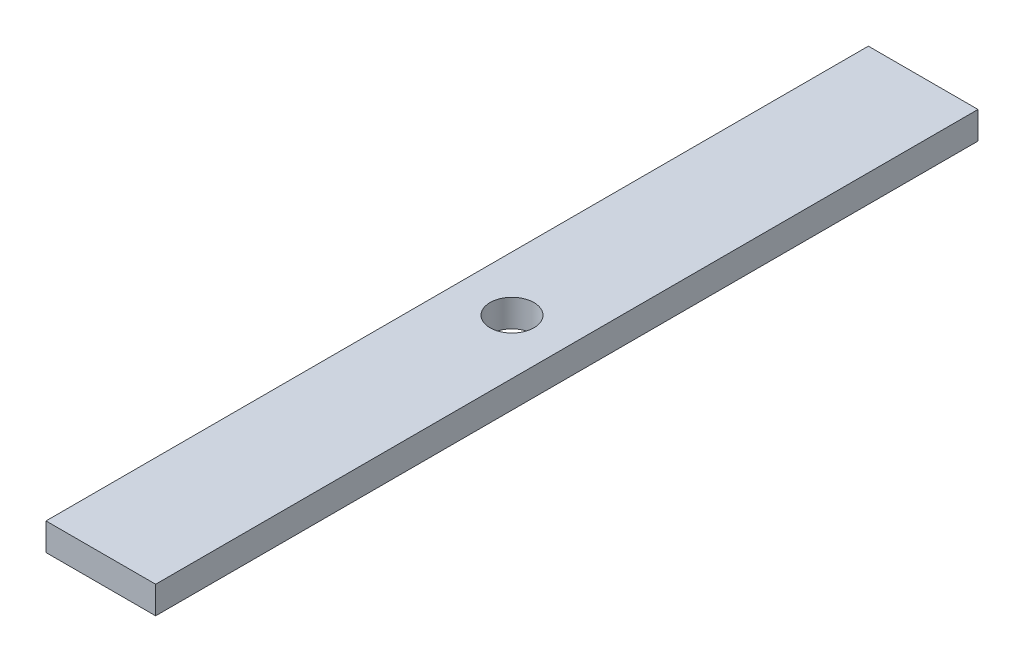
ISO-10303-21;
HEADER;
FILE_DESCRIPTION(('STEP AP214'),'2;1');
FILE_NAME('part.step','',(''),(''),'','','');
FILE_SCHEMA(('AUTOMOTIVE_DESIGN { 1 0 10303 214 1 1 1 1 }'));
ENDSEC;
DATA;
#1=APPLICATION_CONTEXT('core data for automotive mechanical design processes');
#2=APPLICATION_PROTOCOL_DEFINITION('international standard','automotive_design',2000,#1);
#3=PRODUCT_CONTEXT('',#1,'mechanical');
#4=PRODUCT('Part','Part','',(#3));
#5=PRODUCT_RELATED_PRODUCT_CATEGORY('part','',(#4));
#6=PRODUCT_DEFINITION_FORMATION('','',#4);
#7=PRODUCT_DEFINITION_CONTEXT('part definition',#1,'design');
#8=PRODUCT_DEFINITION('design','',#6,#7);
#9=PRODUCT_DEFINITION_SHAPE('','',#8);
#10=(LENGTH_UNIT() NAMED_UNIT(*) SI_UNIT(.MILLI.,.METRE.));
#11=(NAMED_UNIT(*) PLANE_ANGLE_UNIT() SI_UNIT($,.RADIAN.));
#12=(NAMED_UNIT(*) SI_UNIT($,.STERADIAN.) SOLID_ANGLE_UNIT());
#13=UNCERTAINTY_MEASURE_WITH_UNIT(LENGTH_MEASURE(1.E-05),#10,'distance_accuracy_value','');
#14=(GEOMETRIC_REPRESENTATION_CONTEXT(3) GLOBAL_UNCERTAINTY_ASSIGNED_CONTEXT((#13)) GLOBAL_UNIT_ASSIGNED_CONTEXT((#10,
#11,#12)) REPRESENTATION_CONTEXT('',''));
#15=CARTESIAN_POINT('',(0.,0.,0.));
#16=DIRECTION('',(0.,0.,1.));
#17=DIRECTION('',(1.,0.,0.));
#18=AXIS2_PLACEMENT_3D('',#15,#16,#17);
#19=CARTESIAN_POINT('',(-10.,2.5,106.));
#20=DIRECTION('',(1.,0.,0.));
#21=DIRECTION('',(0.,0.,-1.));
#22=AXIS2_PLACEMENT_3D('',#19,#20,#21);
#23=PLANE('',#22);
#24=DIRECTION('',(0.,-1.,0.));
#25=VECTOR('',#24,1.);
#26=CARTESIAN_POINT('',(-10.,2.5,75.));
#27=LINE('',#26,#25);
#28=CARTESIAN_POINT('',(-10.,2.5,75.));
#29=VERTEX_POINT('',#28);
#30=CARTESIAN_POINT('',(-10.,-2.5,75.));
#31=VERTEX_POINT('',#30);
#32=EDGE_CURVE('E74',#29,#31,#27,.T.);
#33=ORIENTED_EDGE('',*,*,#32,.F.);
#34=DIRECTION('',(0.,0.,-1.));
#35=VECTOR('',#34,1.);
#36=CARTESIAN_POINT('',(-10.,2.5,106.));
#37=LINE('',#36,#35);
#38=CARTESIAN_POINT('',(-10.,2.5,-75.));
#39=VERTEX_POINT('',#38);
#40=EDGE_CURVE('E86',#29,#39,#37,.T.);
#41=ORIENTED_EDGE('',*,*,#40,.T.);
#42=DIRECTION('',(0.,1.,0.));
#43=VECTOR('',#42,1.);
#44=CARTESIAN_POINT('',(-10.,2.5,-75.));
#45=LINE('',#44,#43);
#46=CARTESIAN_POINT('',(-10.,-2.5,-75.));
#47=VERTEX_POINT('',#46);
#48=EDGE_CURVE('E56',#47,#39,#45,.T.);
#49=ORIENTED_EDGE('',*,*,#48,.F.);
#50=DIRECTION('',(0.,0.,-1.));
#51=VECTOR('',#50,1.);
#52=CARTESIAN_POINT('',(-10.,-2.5,106.));
#53=LINE('',#52,#51);
#54=EDGE_CURVE('E12',#31,#47,#53,.T.);
#55=ORIENTED_EDGE('',*,*,#54,.F.);
#56=EDGE_LOOP('',(#33,#41,#49,#55));
#57=FACE_BOUND('',#56,.T.);
#58=ADVANCED_FACE('F34',(#57),#23,.F.);
#59=CARTESIAN_POINT('',(-10.,-2.5,106.));
#60=DIRECTION('',(0.,1.,0.));
#61=DIRECTION('',(-1.,0.,0.));
#62=AXIS2_PLACEMENT_3D('',#59,#60,#61);
#63=PLANE('',#62);
#64=CARTESIAN_POINT('',(0.,-2.5,0.));
#65=DIRECTION('',(0.,1.,0.));
#66=DIRECTION('',(-1.,0.,0.));
#67=AXIS2_PLACEMENT_3D('',#64,#65,#66);
#68=CIRCLE('',#67,4.);
#69=CARTESIAN_POINT('',(-4.,-2.5,0.));
#70=VERTEX_POINT('',#69);
#71=EDGE_CURVE('E91',#70,#70,#68,.T.);
#72=ORIENTED_EDGE('',*,*,#71,.T.);
#73=EDGE_LOOP('',(#72));
#74=FACE_BOUND('',#73,.T.);
#75=DIRECTION('',(1.,0.,0.));
#76=VECTOR('',#75,1.);
#77=CARTESIAN_POINT('',(-25.7525042215434,-2.5,75.));
#78=LINE('',#77,#76);
#79=CARTESIAN_POINT('',(9.99999999999998,-2.5,75.));
#80=VERTEX_POINT('',#79);
#81=EDGE_CURVE('E106',#31,#80,#78,.T.);
#82=ORIENTED_EDGE('',*,*,#81,.F.);
#83=ORIENTED_EDGE('',*,*,#54,.T.);
#84=DIRECTION('',(-1.,0.,0.));
#85=VECTOR('',#84,1.);
#86=CARTESIAN_POINT('',(-25.7525042215434,-2.5,-75.));
#87=LINE('',#86,#85);
#88=CARTESIAN_POINT('',(9.99999999999998,-2.5,-75.));
#89=VERTEX_POINT('',#88);
#90=EDGE_CURVE('E80',#89,#47,#87,.T.);
#91=ORIENTED_EDGE('',*,*,#90,.F.);
#92=DIRECTION('',(0.,0.,-1.));
#93=VECTOR('',#92,1.);
#94=CARTESIAN_POINT('',(10.,-2.5,106.));
#95=LINE('',#94,#93);
#96=EDGE_CURVE('E41',#80,#89,#95,.T.);
#97=ORIENTED_EDGE('',*,*,#96,.F.);
#98=EDGE_LOOP('',(#82,#83,#91,#97));
#99=FACE_BOUND('',#98,.T.);
#100=ADVANCED_FACE('F105',(#74,#99),#63,.F.);
#101=CARTESIAN_POINT('',(10.,2.5,106.));
#102=DIRECTION('',(-1.,0.,0.));
#103=DIRECTION('',(0.,0.,1.));
#104=AXIS2_PLACEMENT_3D('',#101,#102,#103);
#105=PLANE('',#104);
#106=DIRECTION('',(0.,1.,0.));
#107=VECTOR('',#106,1.);
#108=CARTESIAN_POINT('',(10.,2.5,75.));
#109=LINE('',#108,#107);
#110=CARTESIAN_POINT('',(10.,2.5,75.));
#111=VERTEX_POINT('',#110);
#112=EDGE_CURVE('E48',#80,#111,#109,.T.);
#113=ORIENTED_EDGE('',*,*,#112,.F.);
#114=ORIENTED_EDGE('',*,*,#96,.T.);
#115=DIRECTION('',(0.,-1.,0.));
#116=VECTOR('',#115,1.);
#117=CARTESIAN_POINT('',(10.,2.5,-75.));
#118=LINE('',#117,#116);
#119=CARTESIAN_POINT('',(9.99999999999998,2.5,-75.));
#120=VERTEX_POINT('',#119);
#121=EDGE_CURVE('E102',#120,#89,#118,.T.);
#122=ORIENTED_EDGE('',*,*,#121,.F.);
#123=DIRECTION('',(0.,0.,-1.));
#124=VECTOR('',#123,1.);
#125=CARTESIAN_POINT('',(10.,2.5,106.));
#126=LINE('',#125,#124);
#127=EDGE_CURVE('E90',#111,#120,#126,.T.);
#128=ORIENTED_EDGE('',*,*,#127,.F.);
#129=EDGE_LOOP('',(#113,#114,#122,#128));
#130=FACE_BOUND('',#129,.T.);
#131=ADVANCED_FACE('F101',(#130),#105,.F.);
#132=CARTESIAN_POINT('',(-10.,2.5,106.));
#133=DIRECTION('',(0.,-1.,0.));
#134=DIRECTION('',(1.,0.,0.));
#135=AXIS2_PLACEMENT_3D('',#132,#133,#134);
#136=PLANE('',#135);
#137=CARTESIAN_POINT('',(0.,2.5,0.));
#138=DIRECTION('',(0.,1.,0.));
#139=DIRECTION('',(-1.,0.,0.));
#140=AXIS2_PLACEMENT_3D('',#137,#138,#139);
#141=CIRCLE('',#140,4.);
#142=CARTESIAN_POINT('',(-4.,2.5,0.));
#143=VERTEX_POINT('',#142);
#144=EDGE_CURVE('E87',#143,#143,#141,.T.);
#145=ORIENTED_EDGE('',*,*,#144,.F.);
#146=EDGE_LOOP('',(#145));
#147=FACE_BOUND('',#146,.T.);
#148=DIRECTION('',(1.,0.,0.));
#149=VECTOR('',#148,1.);
#150=CARTESIAN_POINT('',(-25.7525042215434,2.5,75.));
#151=LINE('',#150,#149);
#152=EDGE_CURVE('E71',#29,#111,#151,.T.);
#153=ORIENTED_EDGE('',*,*,#152,.T.);
#154=ORIENTED_EDGE('',*,*,#127,.T.);
#155=DIRECTION('',(-1.,0.,0.));
#156=VECTOR('',#155,1.);
#157=CARTESIAN_POINT('',(-25.7525042215434,2.5,-75.));
#158=LINE('',#157,#156);
#159=EDGE_CURVE('E81',#120,#39,#158,.T.);
#160=ORIENTED_EDGE('',*,*,#159,.T.);
#161=ORIENTED_EDGE('',*,*,#40,.F.);
#162=EDGE_LOOP('',(#153,#154,#160,#161));
#163=FACE_BOUND('',#162,.T.);
#164=ADVANCED_FACE('F89',(#147,#163),#136,.F.);
#165=CARTESIAN_POINT('',(0.,-2.5,0.));
#166=DIRECTION('',(0.,1.,0.));
#167=DIRECTION('',(-1.,0.,0.));
#168=AXIS2_PLACEMENT_3D('',#165,#166,#167);
#169=CYLINDRICAL_SURFACE('',#168,4.);
#170=CARTESIAN_POINT('',(-4.,-2.5,0.));
#171=CARTESIAN_POINT('',(-4.,-2.44791666666667,0.));
#172=CARTESIAN_POINT('',(-4.,-2.39583333333333,0.));
#173=CARTESIAN_POINT('',(-4.,-2.29166666666667,0.));
#174=CARTESIAN_POINT('',(-4.,-2.23958333333333,0.));
#175=CARTESIAN_POINT('',(-4.,-2.13541666666667,0.));
#176=CARTESIAN_POINT('',(-4.,-2.08333333333333,0.));
#177=CARTESIAN_POINT('',(-4.,-1.97916666666667,0.));
#178=CARTESIAN_POINT('',(-4.,-1.92708333333333,0.));
#179=CARTESIAN_POINT('',(-4.,-1.82291666666667,0.));
#180=CARTESIAN_POINT('',(-4.,-1.77083333333333,0.));
#181=CARTESIAN_POINT('',(-4.,-1.66666666666667,0.));
#182=CARTESIAN_POINT('',(-4.,-1.61458333333333,0.));
#183=CARTESIAN_POINT('',(-4.,-1.51041666666667,0.));
#184=CARTESIAN_POINT('',(-4.,-1.45833333333333,0.));
#185=CARTESIAN_POINT('',(-4.,-1.35416666666667,0.));
#186=CARTESIAN_POINT('',(-4.,-1.30208333333333,0.));
#187=CARTESIAN_POINT('',(-4.,-1.19791666666667,0.));
#188=CARTESIAN_POINT('',(-4.,-1.14583333333333,0.));
#189=CARTESIAN_POINT('',(-4.,-1.04166666666667,0.));
#190=CARTESIAN_POINT('',(-4.,-0.989583333333334,0.));
#191=CARTESIAN_POINT('',(-4.,-0.885416666666667,0.));
#192=CARTESIAN_POINT('',(-4.,-0.833333333333334,0.));
#193=CARTESIAN_POINT('',(-4.,-0.729166666666667,0.));
#194=CARTESIAN_POINT('',(-4.,-0.677083333333334,0.));
#195=CARTESIAN_POINT('',(-4.,-0.572916666666667,0.));
#196=CARTESIAN_POINT('',(-4.,-0.520833333333334,0.));
#197=CARTESIAN_POINT('',(-4.,-0.416666666666667,0.));
#198=CARTESIAN_POINT('',(-4.,-0.364583333333334,0.));
#199=CARTESIAN_POINT('',(-4.,-0.260416666666667,0.));
#200=CARTESIAN_POINT('',(-4.,-0.208333333333334,0.));
#201=CARTESIAN_POINT('',(-4.,-0.104166666666667,0.));
#202=CARTESIAN_POINT('',(-4.,-0.0520833333333334,0.));
#203=CARTESIAN_POINT('',(-4.,0.0520833333333334,0.));
#204=CARTESIAN_POINT('',(-4.,0.104166666666667,0.));
#205=CARTESIAN_POINT('',(-4.,0.208333333333334,0.));
#206=CARTESIAN_POINT('',(-4.,0.260416666666667,0.));
#207=CARTESIAN_POINT('',(-4.,0.364583333333334,0.));
#208=CARTESIAN_POINT('',(-4.,0.416666666666667,0.));
#209=CARTESIAN_POINT('',(-4.,0.520833333333334,0.));
#210=CARTESIAN_POINT('',(-4.,0.572916666666667,0.));
#211=CARTESIAN_POINT('',(-4.,0.677083333333334,0.));
#212=CARTESIAN_POINT('',(-4.,0.729166666666667,0.));
#213=CARTESIAN_POINT('',(-4.,0.833333333333334,0.));
#214=CARTESIAN_POINT('',(-4.,0.885416666666667,0.));
#215=CARTESIAN_POINT('',(-4.,0.989583333333334,0.));
#216=CARTESIAN_POINT('',(-4.,1.04166666666667,0.));
#217=CARTESIAN_POINT('',(-4.,1.14583333333333,0.));
#218=CARTESIAN_POINT('',(-4.,1.19791666666667,0.));
#219=CARTESIAN_POINT('',(-4.,1.30208333333333,0.));
#220=CARTESIAN_POINT('',(-4.,1.35416666666667,0.));
#221=CARTESIAN_POINT('',(-4.,1.45833333333333,0.));
#222=CARTESIAN_POINT('',(-4.,1.51041666666667,0.));
#223=CARTESIAN_POINT('',(-4.,1.61458333333333,0.));
#224=CARTESIAN_POINT('',(-4.,1.66666666666667,0.));
#225=CARTESIAN_POINT('',(-4.,1.77083333333333,0.));
#226=CARTESIAN_POINT('',(-4.,1.82291666666667,0.));
#227=CARTESIAN_POINT('',(-4.,1.92708333333333,0.));
#228=CARTESIAN_POINT('',(-4.,1.97916666666667,0.));
#229=CARTESIAN_POINT('',(-4.,2.08333333333333,0.));
#230=CARTESIAN_POINT('',(-4.,2.13541666666667,0.));
#231=CARTESIAN_POINT('',(-4.,2.23958333333333,0.));
#232=CARTESIAN_POINT('',(-4.,2.29166666666667,0.));
#233=CARTESIAN_POINT('',(-4.,2.39583333333333,0.));
#234=CARTESIAN_POINT('',(-4.,2.44791666666667,0.));
#235=CARTESIAN_POINT('',(-4.,2.5,0.));
#236=B_SPLINE_CURVE_WITH_KNOTS('',3,(#170,#171,#172,#173,#174,#175,#176,#177,#178,#179,#180,
#181,#182,#183,#184,#185,#186,#187,#188,#189,#190,#191,#192,#193,#194,#195,#196,#197,#198,#199,
#200,#201,#202,#203,#204,#205,#206,#207,#208,#209,#210,#211,#212,#213,#214,#215,#216,#217,#218,
#219,#220,#221,#222,#223,#224,#225,#226,#227,#228,#229,#230,#231,#232,#233,#234,#235),
.UNSPECIFIED.,.F.,.F.,(4,2,2,2,2,2,2,2,2,2,2,2,2,2,2,2,2,2,2,2,2,2,2,2,2,2,2,2,2,2,2,2,4),(0.,
0.15625,0.3125,0.46875,0.625,0.78125,0.9375,1.09375,1.25,1.40625,1.5625,1.71875,1.875,2.03125,
2.1875,2.34375,2.5,2.65625,2.8125,2.96875,3.125,3.28125,3.4375,3.59375,3.75,3.90625,4.0625,
4.21875,4.375,4.53125,4.6875,4.84375,5.),.UNSPECIFIED.);
#237=EDGE_CURVE('BSEAM115',#70,#143,#236,.T.);
#238=ORIENTED_EDGE('',*,*,#71,.F.);
#239=ORIENTED_EDGE('',*,*,#144,.T.);
#240=ORIENTED_EDGE('',*,*,#237,.T.);
#241=ORIENTED_EDGE('',*,*,#237,.F.);
#242=EDGE_LOOP('',(#238,#240,#239,#241));
#243=FACE_BOUND('',#242,.T.);
#244=ADVANCED_FACE('F115',(#243),#169,.F.);
#245=CARTESIAN_POINT('',(-25.7525042215434,-2.5,-75.));
#246=DIRECTION('',(0.,0.,-1.));
#247=DIRECTION('',(-1.,0.,0.));
#248=AXIS2_PLACEMENT_3D('',#245,#246,#247);
#249=PLANE('',#248);
#250=ORIENTED_EDGE('',*,*,#48,.T.);
#251=ORIENTED_EDGE('',*,*,#159,.F.);
#252=ORIENTED_EDGE('',*,*,#121,.T.);
#253=ORIENTED_EDGE('',*,*,#90,.T.);
#254=EDGE_LOOP('',(#250,#251,#252,#253));
#255=FACE_BOUND('',#254,.T.);
#256=ADVANCED_FACE('F113',(#255),#249,.T.);
#257=CARTESIAN_POINT('',(-25.7525042215434,-2.5,75.));
#258=DIRECTION('',(0.,0.,1.));
#259=DIRECTION('',(1.,0.,0.));
#260=AXIS2_PLACEMENT_3D('',#257,#258,#259);
#261=PLANE('',#260);
#262=ORIENTED_EDGE('',*,*,#32,.T.);
#263=ORIENTED_EDGE('',*,*,#81,.T.);
#264=ORIENTED_EDGE('',*,*,#112,.T.);
#265=ORIENTED_EDGE('',*,*,#152,.F.);
#266=EDGE_LOOP('',(#262,#263,#264,#265));
#267=FACE_BOUND('',#266,.T.);
#268=ADVANCED_FACE('F73',(#267),#261,.T.);
#269=CLOSED_SHELL('',(#58,#100,#131,#164,#244,#256,#268));
#270=MANIFOLD_SOLID_BREP('B2',#269);
#271=ADVANCED_BREP_SHAPE_REPRESENTATION('',(#18,#270),#14);
#272=SHAPE_DEFINITION_REPRESENTATION(#9,#271);
ENDSEC;
END-ISO-10303-21;
